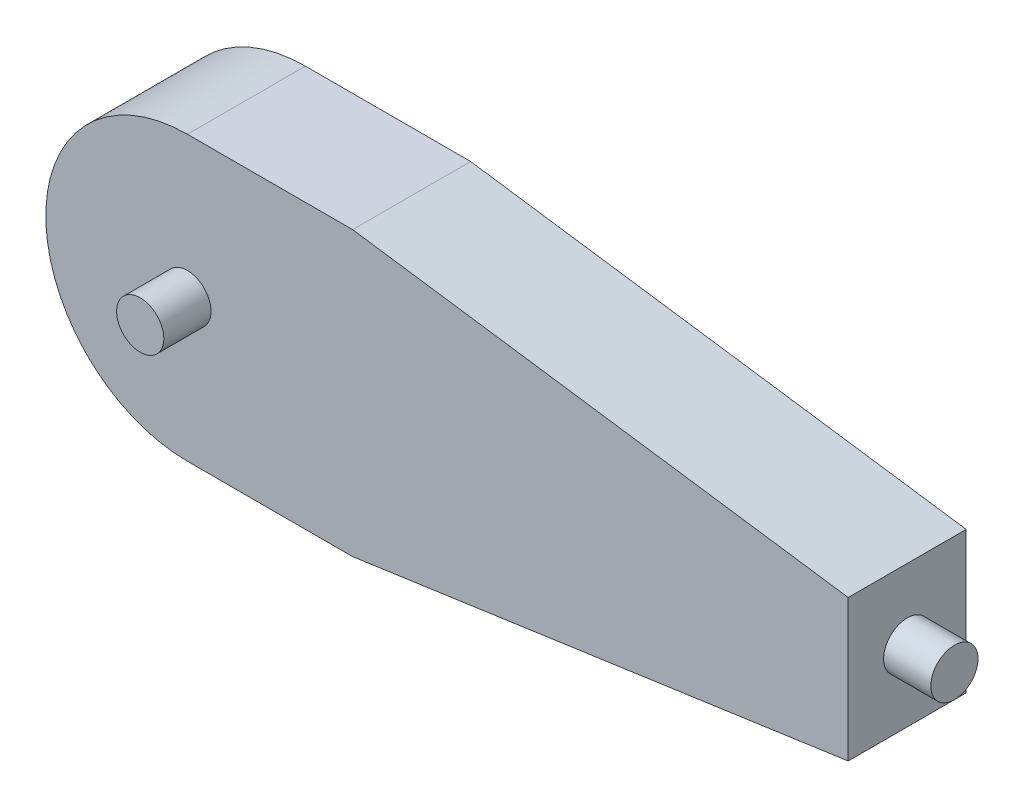
ISO-10303-21;
HEADER;
FILE_DESCRIPTION(('STEP AP214'),'2;1');
FILE_NAME('part.step','',(''),(''),'','','');
FILE_SCHEMA(('AUTOMOTIVE_DESIGN { 1 0 10303 214 1 1 1 1 }'));
ENDSEC;
DATA;
#1=APPLICATION_CONTEXT('core data for automotive mechanical design processes');
#2=APPLICATION_PROTOCOL_DEFINITION('international standard','automotive_design',2000,#1);
#3=PRODUCT_CONTEXT('',#1,'mechanical');
#4=PRODUCT('Part','Part','',(#3));
#5=PRODUCT_RELATED_PRODUCT_CATEGORY('part','',(#4));
#6=PRODUCT_DEFINITION_FORMATION('','',#4);
#7=PRODUCT_DEFINITION_CONTEXT('part definition',#1,'design');
#8=PRODUCT_DEFINITION('design','',#6,#7);
#9=PRODUCT_DEFINITION_SHAPE('','',#8);
#10=(LENGTH_UNIT() NAMED_UNIT(*) SI_UNIT(.MILLI.,.METRE.));
#11=(NAMED_UNIT(*) PLANE_ANGLE_UNIT() SI_UNIT($,.RADIAN.));
#12=(NAMED_UNIT(*) SI_UNIT($,.STERADIAN.) SOLID_ANGLE_UNIT());
#13=UNCERTAINTY_MEASURE_WITH_UNIT(LENGTH_MEASURE(1.E-05),#10,'distance_accuracy_value','');
#14=(GEOMETRIC_REPRESENTATION_CONTEXT(3) GLOBAL_UNCERTAINTY_ASSIGNED_CONTEXT((#13)) GLOBAL_UNIT_ASSIGNED_CONTEXT((#10,
#11,#12)) REPRESENTATION_CONTEXT('',''));
#15=CARTESIAN_POINT('',(0.,0.,0.));
#16=DIRECTION('',(0.,0.,1.));
#17=DIRECTION('',(1.,0.,0.));
#18=AXIS2_PLACEMENT_3D('',#15,#16,#17);
#19=CARTESIAN_POINT('',(0.,0.,50.));
#20=DIRECTION('',(0.,0.,-1.));
#21=DIRECTION('',(-1.,0.,0.));
#22=AXIS2_PLACEMENT_3D('',#19,#20,#21);
#23=CYLINDRICAL_SURFACE('',#22,60.);
#24=CARTESIAN_POINT('',(0.,0.,0.));
#25=DIRECTION('',(0.,0.,1.));
#26=DIRECTION('',(1.,0.,0.));
#27=AXIS2_PLACEMENT_3D('',#24,#25,#26);
#28=CIRCLE('',#27,60.);
#29=CARTESIAN_POINT('',(0.,60.,0.));
#30=VERTEX_POINT('',#29);
#31=CARTESIAN_POINT('',(0.,-60.,0.));
#32=VERTEX_POINT('',#31);
#33=EDGE_CURVE('E118',#30,#32,#28,.T.);
#34=ORIENTED_EDGE('',*,*,#33,.T.);
#35=DIRECTION('',(0.,0.,-1.));
#36=VECTOR('',#35,1.);
#37=CARTESIAN_POINT('',(0.,-60.,50.));
#38=LINE('',#37,#36);
#39=CARTESIAN_POINT('',(0.,-60.,50.));
#40=VERTEX_POINT('',#39);
#41=EDGE_CURVE('E41',#40,#32,#38,.T.);
#42=ORIENTED_EDGE('',*,*,#41,.F.);
#43=CARTESIAN_POINT('',(0.,0.,50.));
#44=DIRECTION('',(0.,0.,1.));
#45=DIRECTION('',(1.,0.,0.));
#46=AXIS2_PLACEMENT_3D('',#43,#44,#45);
#47=CIRCLE('',#46,60.);
#48=CARTESIAN_POINT('',(0.,60.,50.));
#49=VERTEX_POINT('',#48);
#50=EDGE_CURVE('E129',#49,#40,#47,.T.);
#51=ORIENTED_EDGE('',*,*,#50,.F.);
#52=DIRECTION('',(0.,0.,-1.));
#53=VECTOR('',#52,1.);
#54=CARTESIAN_POINT('',(0.,60.,50.));
#55=LINE('',#54,#53);
#56=EDGE_CURVE('E114',#49,#30,#55,.T.);
#57=ORIENTED_EDGE('',*,*,#56,.T.);
#58=EDGE_LOOP('',(#34,#42,#51,#57));
#59=FACE_BOUND('',#58,.T.);
#60=ADVANCED_FACE('F33',(#59),#23,.T.);
#61=CARTESIAN_POINT('',(0.,-60.,50.));
#62=DIRECTION('',(0.,1.,0.));
#63=DIRECTION('',(0.,0.,1.));
#64=AXIS2_PLACEMENT_3D('',#61,#62,#63);
#65=PLANE('',#64);
#66=DIRECTION('',(1.,0.,0.));
#67=VECTOR('',#66,1.);
#68=CARTESIAN_POINT('',(0.,-60.,0.));
#69=LINE('',#68,#67);
#70=CARTESIAN_POINT('',(70.,-60.,0.));
#71=VERTEX_POINT('',#70);
#72=EDGE_CURVE('E121',#32,#71,#69,.T.);
#73=ORIENTED_EDGE('',*,*,#72,.T.);
#74=DIRECTION('',(0.,0.,-1.));
#75=VECTOR('',#74,1.);
#76=CARTESIAN_POINT('',(70.,-60.,50.));
#77=LINE('',#76,#75);
#78=CARTESIAN_POINT('',(70.,-60.,50.));
#79=VERTEX_POINT('',#78);
#80=EDGE_CURVE('E133',#79,#71,#77,.T.);
#81=ORIENTED_EDGE('',*,*,#80,.F.);
#82=DIRECTION('',(1.,0.,0.));
#83=VECTOR('',#82,1.);
#84=CARTESIAN_POINT('',(0.,-60.,50.));
#85=LINE('',#84,#83);
#86=EDGE_CURVE('E87',#40,#79,#85,.T.);
#87=ORIENTED_EDGE('',*,*,#86,.F.);
#88=ORIENTED_EDGE('',*,*,#41,.T.);
#89=EDGE_LOOP('',(#73,#81,#87,#88));
#90=FACE_BOUND('',#89,.T.);
#91=ADVANCED_FACE('F136',(#90),#65,.F.);
#92=CARTESIAN_POINT('',(70.,-60.,50.));
#93=DIRECTION('',(-0.14142135623731,0.989949493661166,0.));
#94=DIRECTION('',(-0.989949493661167,-0.14142135623731,0.));
#95=AXIS2_PLACEMENT_3D('',#92,#93,#94);
#96=PLANE('',#95);
#97=DIRECTION('',(0.989949493661166,0.141421356237309,0.));
#98=VECTOR('',#97,1.);
#99=CARTESIAN_POINT('',(70.,-60.,0.));
#100=LINE('',#99,#98);
#101=CARTESIAN_POINT('',(280.,-30.,0.));
#102=VERTEX_POINT('',#101);
#103=EDGE_CURVE('E124',#71,#102,#100,.T.);
#104=ORIENTED_EDGE('',*,*,#103,.T.);
#105=DIRECTION('',(0.,0.,-1.));
#106=VECTOR('',#105,1.);
#107=CARTESIAN_POINT('',(280.,-30.,50.));
#108=LINE('',#107,#106);
#109=CARTESIAN_POINT('',(280.,-30.,50.));
#110=VERTEX_POINT('',#109);
#111=EDGE_CURVE('E109',#110,#102,#108,.T.);
#112=ORIENTED_EDGE('',*,*,#111,.F.);
#113=DIRECTION('',(0.989949493661166,0.141421356237309,0.));
#114=VECTOR('',#113,1.);
#115=CARTESIAN_POINT('',(70.,-60.,50.));
#116=LINE('',#115,#114);
#117=EDGE_CURVE('E100',#79,#110,#116,.T.);
#118=ORIENTED_EDGE('',*,*,#117,.F.);
#119=ORIENTED_EDGE('',*,*,#80,.T.);
#120=EDGE_LOOP('',(#104,#112,#118,#119));
#121=FACE_BOUND('',#120,.T.);
#122=ADVANCED_FACE('F144',(#121),#96,.F.);
#123=CARTESIAN_POINT('',(280.,30.,50.));
#124=DIRECTION('',(-1.,0.,0.));
#125=DIRECTION('',(0.,0.,1.));
#126=AXIS2_PLACEMENT_3D('',#123,#124,#125);
#127=PLANE('',#126);
#128=CARTESIAN_POINT('',(280.,0.,25.));
#129=DIRECTION('',(-1.,0.,0.));
#130=DIRECTION('',(0.,0.,1.));
#131=AXIS2_PLACEMENT_3D('',#128,#129,#130);
#132=CIRCLE('',#131,10.);
#133=CARTESIAN_POINT('',(280.,0.,35.));
#134=VERTEX_POINT('',#133);
#135=EDGE_CURVE('E11',#134,#134,#132,.F.);
#136=ORIENTED_EDGE('',*,*,#135,.F.);
#137=EDGE_LOOP('',(#136));
#138=FACE_BOUND('',#137,.T.);
#139=DIRECTION('',(0.,1.,0.));
#140=VECTOR('',#139,1.);
#141=CARTESIAN_POINT('',(280.,30.,0.));
#142=LINE('',#141,#140);
#143=CARTESIAN_POINT('',(280.,30.,0.));
#144=VERTEX_POINT('',#143);
#145=EDGE_CURVE('E108',#102,#144,#142,.T.);
#146=ORIENTED_EDGE('',*,*,#145,.T.);
#147=DIRECTION('',(0.,0.,-1.));
#148=VECTOR('',#147,1.);
#149=CARTESIAN_POINT('',(280.,30.,50.));
#150=LINE('',#149,#148);
#151=CARTESIAN_POINT('',(280.,30.,50.));
#152=VERTEX_POINT('',#151);
#153=EDGE_CURVE('E105',#152,#144,#150,.T.);
#154=ORIENTED_EDGE('',*,*,#153,.F.);
#155=DIRECTION('',(0.,1.,0.));
#156=VECTOR('',#155,1.);
#157=CARTESIAN_POINT('',(280.,30.,50.));
#158=LINE('',#157,#156);
#159=EDGE_CURVE('E94',#110,#152,#158,.T.);
#160=ORIENTED_EDGE('',*,*,#159,.F.);
#161=ORIENTED_EDGE('',*,*,#111,.T.);
#162=EDGE_LOOP('',(#146,#154,#160,#161));
#163=FACE_BOUND('',#162,.T.);
#164=ADVANCED_FACE('F106',(#138,#163),#127,.F.);
#165=CARTESIAN_POINT('',(70.,60.,50.));
#166=DIRECTION('',(-0.14142135623731,-0.989949493661166,0.));
#167=DIRECTION('',(0.989949493661167,-0.14142135623731,0.));
#168=AXIS2_PLACEMENT_3D('',#165,#166,#167);
#169=PLANE('',#168);
#170=DIRECTION('',(-0.989949493661166,0.141421356237309,0.));
#171=VECTOR('',#170,1.);
#172=CARTESIAN_POINT('',(70.,60.,0.));
#173=LINE('',#172,#171);
#174=CARTESIAN_POINT('',(70.,60.,0.));
#175=VERTEX_POINT('',#174);
#176=EDGE_CURVE('E72',#144,#175,#173,.T.);
#177=ORIENTED_EDGE('',*,*,#176,.T.);
#178=DIRECTION('',(0.,0.,-1.));
#179=VECTOR('',#178,1.);
#180=CARTESIAN_POINT('',(70.,60.,50.));
#181=LINE('',#180,#179);
#182=CARTESIAN_POINT('',(70.,60.,50.));
#183=VERTEX_POINT('',#182);
#184=EDGE_CURVE('E110',#183,#175,#181,.T.);
#185=ORIENTED_EDGE('',*,*,#184,.F.);
#186=DIRECTION('',(-0.989949493661166,0.141421356237309,0.));
#187=VECTOR('',#186,1.);
#188=CARTESIAN_POINT('',(70.,60.,50.));
#189=LINE('',#188,#187);
#190=EDGE_CURVE('E98',#152,#183,#189,.T.);
#191=ORIENTED_EDGE('',*,*,#190,.F.);
#192=ORIENTED_EDGE('',*,*,#153,.T.);
#193=EDGE_LOOP('',(#177,#185,#191,#192));
#194=FACE_BOUND('',#193,.T.);
#195=ADVANCED_FACE('F112',(#194),#169,.F.);
#196=CARTESIAN_POINT('',(0.,60.,50.));
#197=DIRECTION('',(0.,-1.,0.));
#198=DIRECTION('',(0.,0.,-1.));
#199=AXIS2_PLACEMENT_3D('',#196,#197,#198);
#200=PLANE('',#199);
#201=DIRECTION('',(-1.,0.,0.));
#202=VECTOR('',#201,1.);
#203=CARTESIAN_POINT('',(0.,60.,0.));
#204=LINE('',#203,#202);
#205=EDGE_CURVE('E78',#175,#30,#204,.T.);
#206=ORIENTED_EDGE('',*,*,#205,.T.);
#207=ORIENTED_EDGE('',*,*,#56,.F.);
#208=DIRECTION('',(-1.,0.,0.));
#209=VECTOR('',#208,1.);
#210=CARTESIAN_POINT('',(0.,60.,50.));
#211=LINE('',#210,#209);
#212=EDGE_CURVE('E49',#183,#49,#211,.T.);
#213=ORIENTED_EDGE('',*,*,#212,.F.);
#214=ORIENTED_EDGE('',*,*,#184,.T.);
#215=EDGE_LOOP('',(#206,#207,#213,#214));
#216=FACE_BOUND('',#215,.T.);
#217=ADVANCED_FACE('F172',(#216),#200,.F.);
#218=CARTESIAN_POINT('',(0.,0.,50.));
#219=DIRECTION('',(0.,0.,1.));
#220=DIRECTION('',(1.,0.,0.));
#221=AXIS2_PLACEMENT_3D('',#218,#219,#220);
#222=PLANE('',#221);
#223=CARTESIAN_POINT('',(0.,0.,50.));
#224=DIRECTION('',(0.,0.,1.));
#225=DIRECTION('',(1.,0.,0.));
#226=AXIS2_PLACEMENT_3D('',#223,#224,#225);
#227=CIRCLE('',#226,10.);
#228=CARTESIAN_POINT('',(10.,0.,50.));
#229=VERTEX_POINT('',#228);
#230=EDGE_CURVE('E148',#229,#229,#227,.T.);
#231=ORIENTED_EDGE('',*,*,#230,.F.);
#232=EDGE_LOOP('',(#231));
#233=FACE_BOUND('',#232,.T.);
#234=ORIENTED_EDGE('',*,*,#50,.T.);
#235=ORIENTED_EDGE('',*,*,#86,.T.);
#236=ORIENTED_EDGE('',*,*,#117,.T.);
#237=ORIENTED_EDGE('',*,*,#159,.T.);
#238=ORIENTED_EDGE('',*,*,#190,.T.);
#239=ORIENTED_EDGE('',*,*,#212,.T.);
#240=EDGE_LOOP('',(#234,#235,#236,#237,#238,#239));
#241=FACE_BOUND('',#240,.T.);
#242=ADVANCED_FACE('F96',(#233,#241),#222,.T.);
#243=CARTESIAN_POINT('',(0.,0.,0.));
#244=DIRECTION('',(0.,0.,1.));
#245=DIRECTION('',(1.,0.,0.));
#246=AXIS2_PLACEMENT_3D('',#243,#244,#245);
#247=PLANE('',#246);
#248=ORIENTED_EDGE('',*,*,#33,.F.);
#249=ORIENTED_EDGE('',*,*,#205,.F.);
#250=ORIENTED_EDGE('',*,*,#176,.F.);
#251=ORIENTED_EDGE('',*,*,#145,.F.);
#252=ORIENTED_EDGE('',*,*,#103,.F.);
#253=ORIENTED_EDGE('',*,*,#72,.F.);
#254=EDGE_LOOP('',(#248,#249,#250,#251,#252,#253));
#255=FACE_BOUND('',#254,.T.);
#256=ADVANCED_FACE('F141',(#255),#247,.F.);
#257=CARTESIAN_POINT('',(0.,0.,70.));
#258=DIRECTION('',(0.,0.,-1.));
#259=DIRECTION('',(-1.,0.,0.));
#260=AXIS2_PLACEMENT_3D('',#257,#258,#259);
#261=CYLINDRICAL_SURFACE('',#260,10.);
#262=CARTESIAN_POINT('',(0.,0.,70.));
#263=DIRECTION('',(0.,0.,1.));
#264=DIRECTION('',(1.,0.,0.));
#265=AXIS2_PLACEMENT_3D('',#262,#263,#264);
#266=CIRCLE('',#265,10.);
#267=CARTESIAN_POINT('',(10.,0.,70.));
#268=VERTEX_POINT('',#267);
#269=EDGE_CURVE('E122',#268,#268,#266,.T.);
#270=ORIENTED_EDGE('',*,*,#269,.F.);
#271=EDGE_LOOP('',(#270));
#272=FACE_BOUND('',#271,.T.);
#273=ORIENTED_EDGE('',*,*,#230,.T.);
#274=EDGE_LOOP('',(#273));
#275=FACE_BOUND('',#274,.T.);
#276=ADVANCED_FACE('F211',(#272,#275),#261,.T.);
#277=CARTESIAN_POINT('',(0.,0.,70.));
#278=DIRECTION('',(0.,0.,1.));
#279=DIRECTION('',(1.,0.,0.));
#280=AXIS2_PLACEMENT_3D('',#277,#278,#279);
#281=PLANE('',#280);
#282=ORIENTED_EDGE('',*,*,#269,.T.);
#283=EDGE_LOOP('',(#282));
#284=FACE_BOUND('',#283,.T.);
#285=ADVANCED_FACE('F162',(#284),#281,.T.);
#286=CARTESIAN_POINT('',(300.,0.,25.));
#287=DIRECTION('',(-1.,0.,0.));
#288=DIRECTION('',(0.,0.,1.));
#289=AXIS2_PLACEMENT_3D('',#286,#287,#288);
#290=CYLINDRICAL_SURFACE('',#289,10.);
#291=CARTESIAN_POINT('',(300.,0.,25.));
#292=DIRECTION('',(1.,0.,0.));
#293=DIRECTION('',(0.,0.,-1.));
#294=AXIS2_PLACEMENT_3D('',#291,#292,#293);
#295=CIRCLE('',#294,10.);
#296=CARTESIAN_POINT('',(300.,0.,15.));
#297=VERTEX_POINT('',#296);
#298=EDGE_CURVE('E151',#297,#297,#295,.T.);
#299=ORIENTED_EDGE('',*,*,#298,.F.);
#300=EDGE_LOOP('',(#299));
#301=FACE_BOUND('',#300,.T.);
#302=ORIENTED_EDGE('',*,*,#135,.T.);
#303=EDGE_LOOP('',(#302));
#304=FACE_BOUND('',#303,.T.);
#305=ADVANCED_FACE('F159',(#301,#304),#290,.T.);
#306=CARTESIAN_POINT('',(300.,0.,25.));
#307=DIRECTION('',(1.,0.,0.));
#308=DIRECTION('',(0.,0.,-1.));
#309=AXIS2_PLACEMENT_3D('',#306,#307,#308);
#310=PLANE('',#309);
#311=ORIENTED_EDGE('',*,*,#298,.T.);
#312=EDGE_LOOP('',(#311));
#313=FACE_BOUND('',#312,.T.);
#314=ADVANCED_FACE('F157',(#313),#310,.T.);
#315=CLOSED_SHELL('',(#60,#91,#122,#164,#195,#217,#242,#256,#276,#285,#305,#314));
#316=MANIFOLD_SOLID_BREP('B2',#315);
#317=ADVANCED_BREP_SHAPE_REPRESENTATION('',(#18,#316),#14);
#318=SHAPE_DEFINITION_REPRESENTATION(#9,#317);
ENDSEC;
END-ISO-10303-21;
